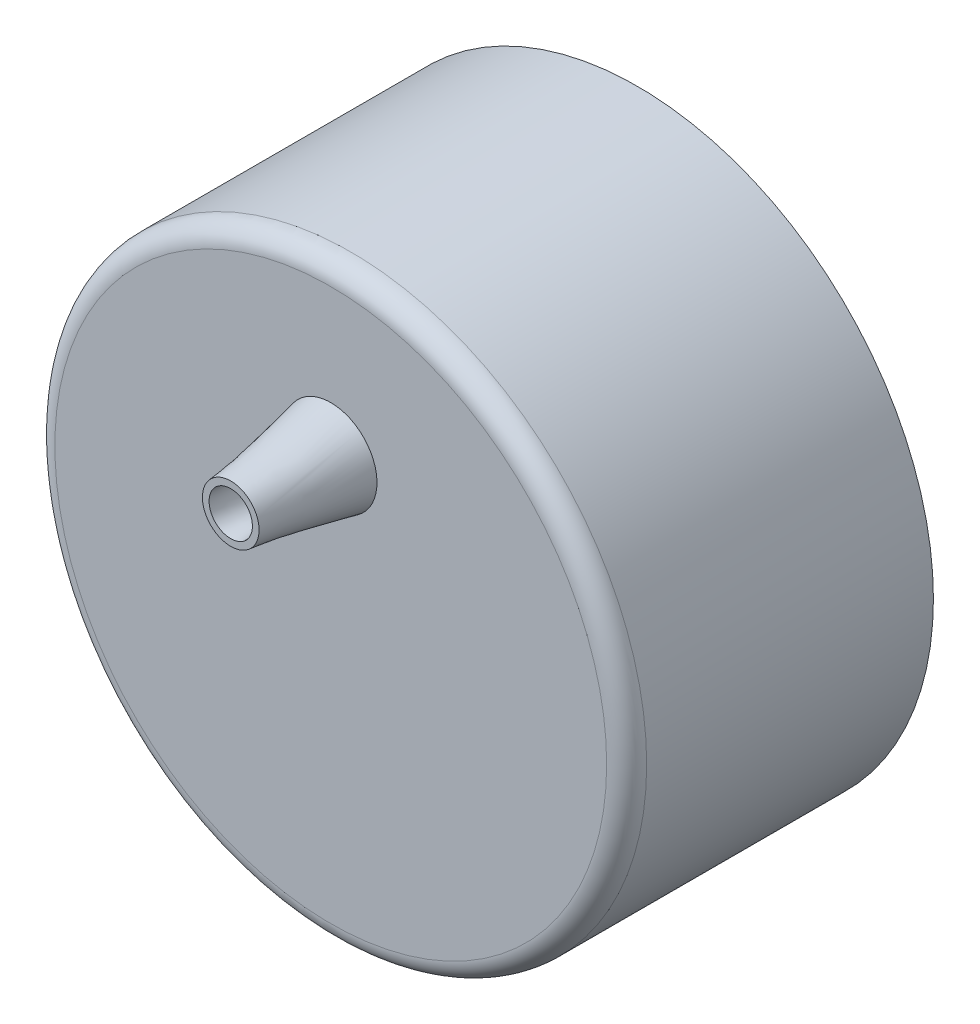
ISO-10303-21;
HEADER;
FILE_DESCRIPTION(('STEP AP214'),'2;1');
FILE_NAME('part.step','',(''),(''),'','','');
FILE_SCHEMA(('AUTOMOTIVE_DESIGN { 1 0 10303 214 1 1 1 1 }'));
ENDSEC;
DATA;
#1=APPLICATION_CONTEXT('core data for automotive mechanical design processes');
#2=APPLICATION_PROTOCOL_DEFINITION('international standard','automotive_design',2000,#1);
#3=PRODUCT_CONTEXT('',#1,'mechanical');
#4=PRODUCT('Part','Part','',(#3));
#5=PRODUCT_RELATED_PRODUCT_CATEGORY('part','',(#4));
#6=PRODUCT_DEFINITION_FORMATION('','',#4);
#7=PRODUCT_DEFINITION_CONTEXT('part definition',#1,'design');
#8=PRODUCT_DEFINITION('design','',#6,#7);
#9=PRODUCT_DEFINITION_SHAPE('','',#8);
#10=(LENGTH_UNIT() NAMED_UNIT(*) SI_UNIT(.MILLI.,.METRE.));
#11=(NAMED_UNIT(*) PLANE_ANGLE_UNIT() SI_UNIT($,.RADIAN.));
#12=(NAMED_UNIT(*) SI_UNIT($,.STERADIAN.) SOLID_ANGLE_UNIT());
#13=UNCERTAINTY_MEASURE_WITH_UNIT(LENGTH_MEASURE(1.E-05),#10,'distance_accuracy_value','');
#14=(GEOMETRIC_REPRESENTATION_CONTEXT(3) GLOBAL_UNCERTAINTY_ASSIGNED_CONTEXT((#13)) GLOBAL_UNIT_ASSIGNED_CONTEXT((#10,
#11,#12)) REPRESENTATION_CONTEXT('',''));
#15=CARTESIAN_POINT('',(0.,0.,0.));
#16=DIRECTION('',(0.,0.,1.));
#17=DIRECTION('',(1.,0.,0.));
#18=AXIS2_PLACEMENT_3D('',#15,#16,#17);
#19=CARTESIAN_POINT('',(177.565086814611,-57.2311730373818,61.));
#20=DIRECTION('',(0.,0.,1.));
#21=DIRECTION('',(1.,0.,0.));
#22=AXIS2_PLACEMENT_3D('',#19,#20,#21);
#23=PLANE('',#22);
#24=CARTESIAN_POINT('',(177.565086814611,-57.2311730373818,61.));
#25=DIRECTION('',(0.,0.,1.));
#26=DIRECTION('',(1.,0.,0.));
#27=AXIS2_PLACEMENT_3D('',#24,#25,#26);
#28=CIRCLE('',#27,3.25000000000001);
#29=CARTESIAN_POINT('',(180.786296753826,-56.7995406388017,61.));
#30=VERTEX_POINT('',#29);
#31=EDGE_CURVE('E63',#30,#30,#28,.T.);
#32=ORIENTED_EDGE('',*,*,#31,.F.);
#33=EDGE_LOOP('',(#32));
#34=FACE_BOUND('',#33,.T.);
#35=CARTESIAN_POINT('',(177.565086814611,-57.2311730373818,61.));
#36=DIRECTION('',(0.,0.,1.));
#37=DIRECTION('',(1.,0.,0.));
#38=AXIS2_PLACEMENT_3D('',#35,#36,#37);
#39=CIRCLE('',#38,4.25000000000001);
#40=CARTESIAN_POINT('',(181.556543196127,-55.7714552720413,61.));
#41=VERTEX_POINT('',#40);
#42=EDGE_CURVE('E12',#41,#41,#39,.T.);
#43=ORIENTED_EDGE('',*,*,#42,.T.);
#44=EDGE_LOOP('',(#43));
#45=FACE_BOUND('',#44,.T.);
#46=ADVANCED_FACE('F50',(#34,#45),#23,.T.);
#47=CARTESIAN_POINT('',(177.565086814611,-57.2311730373818,46.));
#48=DIRECTION('',(0.,0.,1.));
#49=DIRECTION('',(1.,0.,0.));
#50=AXIS2_PLACEMENT_3D('',#47,#48,#49);
#51=PLANE('',#50);
#52=CARTESIAN_POINT('',(177.565086814611,-57.2311730373818,46.));
#53=DIRECTION('',(0.,0.,1.));
#54=DIRECTION('',(1.,0.,0.));
#55=AXIS2_PLACEMENT_3D('',#52,#53,#54);
#56=CIRCLE('',#55,4.93);
#57=CARTESIAN_POINT('',(178.564828180719,-52.4036045810165,46.));
#58=VERTEX_POINT('',#57);
#59=EDGE_CURVE('E128',#58,#58,#56,.T.);
#60=ORIENTED_EDGE('',*,*,#59,.T.);
#61=EDGE_LOOP('',(#60));
#62=FACE_BOUND('',#61,.T.);
#63=CARTESIAN_POINT('',(177.565086814611,-57.2311730373818,46.));
#64=DIRECTION('',(0.,0.,1.));
#65=DIRECTION('',(1.,0.,0.));
#66=AXIS2_PLACEMENT_3D('',#63,#64,#65);
#67=CIRCLE('',#66,6.93);
#68=CARTESIAN_POINT('',(181.894619380869,-51.8200689210563,46.));
#69=VERTEX_POINT('',#68);
#70=EDGE_CURVE('E58',#69,#69,#67,.T.);
#71=ORIENTED_EDGE('',*,*,#70,.F.);
#72=EDGE_LOOP('',(#71));
#73=FACE_BOUND('',#72,.T.);
#74=ADVANCED_FACE('F82',(#62,#73),#51,.F.);
#75=CARTESIAN_POINT('',(181.894619380869,-51.8200689210563,46.));
#76=CARTESIAN_POINT('',(181.556543196127,-55.7714552720413,61.));
#77=CARTESIAN_POINT('',(171.072411148218,-43.161003788541,46.));
#78=CARTESIAN_POINT('',(178.637107665446,-47.7885425090081,61.));
#79=CARTESIAN_POINT('',(162.413346015702,-53.983212021192,46.));
#80=CARTESIAN_POINT('',(170.654194902413,-50.7079780396891,61.));
#81=CARTESIAN_POINT('',(173.235554248353,-62.6422771537073,46.));
#82=CARTESIAN_POINT('',(173.573630433094,-58.6908908027223,61.));
#83=CARTESIAN_POINT('',(184.057762481004,-71.3013422862225,46.));
#84=CARTESIAN_POINT('',(176.493065963775,-66.6738035657554,61.));
#85=CARTESIAN_POINT('',(192.716827613519,-60.4791340535716,46.));
#86=CARTESIAN_POINT('',(184.475978726808,-63.7543680350744,61.));
#87=CARTESIAN_POINT('',(181.894619380869,-51.8200689210563,46.));
#88=CARTESIAN_POINT('',(181.556543196127,-55.7714552720413,61.));
#89=(BOUNDED_SURFACE() B_SPLINE_SURFACE(3,1,((#75,#76),(#77,#78),(#79,#80),(#81,#82),(#83,#84),
(#85,#86),(#87,#88)),.UNSPECIFIED.,.T.,.F.,.F.) B_SPLINE_SURFACE_WITH_KNOTS((4,3,4),(2,2),(0.,
0.5,1.),(0.,1.),.UNSPECIFIED.) GEOMETRIC_REPRESENTATION_ITEM() RATIONAL_B_SPLINE_SURFACE(((1.,
1.),(0.333333333333333,0.333333333333333),(0.333333333333333,0.333333333333333),(1.,1.),
(0.333333333333333,0.333333333333334),(0.333333333333333,0.333333333333334),(1.,1.))) REPRESENTATION_ITEM('') SURFACE());
#90=CARTESIAN_POINT('',(181.894619380869,-51.8200689210563,46.));
#91=CARTESIAN_POINT('',(181.891097753944,-51.8612291955457,46.15625));
#92=CARTESIAN_POINT('',(181.88757612702,-51.9023894700352,46.3125));
#93=CARTESIAN_POINT('',(181.880532873171,-51.984710019014,46.625));
#94=CARTESIAN_POINT('',(181.877011246247,-52.0258702935035,46.78125));
#95=CARTESIAN_POINT('',(181.869967992398,-52.1081908424823,47.09375));
#96=CARTESIAN_POINT('',(181.866446365473,-52.1493511169717,47.25));
#97=CARTESIAN_POINT('',(181.859403111625,-52.2316716659506,47.5625));
#98=CARTESIAN_POINT('',(181.8558814847,-52.27283194044,47.71875));
#99=CARTESIAN_POINT('',(181.848838230852,-52.3551524894189,48.03125));
#100=CARTESIAN_POINT('',(181.845316603927,-52.3963127639083,48.1875));
#101=CARTESIAN_POINT('',(181.838273350078,-52.4786333128871,48.5));
#102=CARTESIAN_POINT('',(181.834751723154,-52.5197935873766,48.65625));
#103=CARTESIAN_POINT('',(181.827708469305,-52.6021141363554,48.96875));
#104=CARTESIAN_POINT('',(181.824186842381,-52.6432744108448,49.125));
#105=CARTESIAN_POINT('',(181.817143588532,-52.7255949598237,49.4375));
#106=CARTESIAN_POINT('',(181.813621961608,-52.7667552343131,49.59375));
#107=CARTESIAN_POINT('',(181.806578707759,-52.849075783292,49.90625));
#108=CARTESIAN_POINT('',(181.803057080834,-52.8902360577814,50.0625));
#109=CARTESIAN_POINT('',(181.796013826986,-52.9725566067603,50.375));
#110=CARTESIAN_POINT('',(181.792492200061,-53.0137168812497,50.53125));
#111=CARTESIAN_POINT('',(181.785448946213,-53.0960374302285,50.84375));
#112=CARTESIAN_POINT('',(181.781927319288,-53.137197704718,51.));
#113=CARTESIAN_POINT('',(181.774884065439,-53.2195182536968,51.3125));
#114=CARTESIAN_POINT('',(181.771362438515,-53.2606785281863,51.46875));
#115=CARTESIAN_POINT('',(181.764319184666,-53.3429990771651,51.78125));
#116=CARTESIAN_POINT('',(181.760797557742,-53.3841593516545,51.9375));
#117=CARTESIAN_POINT('',(181.753754303893,-53.4664799006334,52.25));
#118=CARTESIAN_POINT('',(181.750232676969,-53.5076401751228,52.40625));
#119=CARTESIAN_POINT('',(181.74318942312,-53.5899607241017,52.71875));
#120=CARTESIAN_POINT('',(181.739667796196,-53.6311209985911,52.875));
#121=CARTESIAN_POINT('',(181.732624542347,-53.7134415475699,53.1875));
#122=CARTESIAN_POINT('',(181.729102915422,-53.7546018220594,53.34375));
#123=CARTESIAN_POINT('',(181.722059661574,-53.8369223710382,53.65625));
#124=CARTESIAN_POINT('',(181.718538034649,-53.8780826455277,53.8125));
#125=CARTESIAN_POINT('',(181.7114947808,-53.9604031945065,54.125));
#126=CARTESIAN_POINT('',(181.707973153876,-54.0015634689959,54.28125));
#127=CARTESIAN_POINT('',(181.700929900027,-54.0838840179748,54.59375));
#128=CARTESIAN_POINT('',(181.697408273103,-54.1250442924642,54.75));
#129=CARTESIAN_POINT('',(181.690365019254,-54.2073648414431,55.0625));
#130=CARTESIAN_POINT('',(181.68684339233,-54.2485251159325,55.21875));
#131=CARTESIAN_POINT('',(181.679800138481,-54.3308456649114,55.53125));
#132=CARTESIAN_POINT('',(181.676278511557,-54.3720059394008,55.6875));
#133=CARTESIAN_POINT('',(181.669235257708,-54.4543264883796,56.));
#134=CARTESIAN_POINT('',(181.665713630783,-54.4954867628691,56.15625));
#135=CARTESIAN_POINT('',(181.658670376935,-54.5778073118479,56.46875));
#136=CARTESIAN_POINT('',(181.65514875001,-54.6189675863373,56.625));
#137=CARTESIAN_POINT('',(181.648105496161,-54.7012881353162,56.9375));
#138=CARTESIAN_POINT('',(181.644583869237,-54.7424484098056,57.09375));
#139=CARTESIAN_POINT('',(181.637540615388,-54.8247689587845,57.40625));
#140=CARTESIAN_POINT('',(181.634018988464,-54.8659292332739,57.5625));
#141=CARTESIAN_POINT('',(181.626975734615,-54.9482497822528,57.875));
#142=CARTESIAN_POINT('',(181.623454107691,-54.9894100567422,58.03125));
#143=CARTESIAN_POINT('',(181.616410853842,-55.071730605721,58.34375));
#144=CARTESIAN_POINT('',(181.612889226918,-55.1128908802105,58.5));
#145=CARTESIAN_POINT('',(181.605845973069,-55.1952114291893,58.8125));
#146=CARTESIAN_POINT('',(181.602324346144,-55.2363717036787,58.96875));
#147=CARTESIAN_POINT('',(181.595281092296,-55.3186922526576,59.28125));
#148=CARTESIAN_POINT('',(181.591759465371,-55.359852527147,59.4375));
#149=CARTESIAN_POINT('',(181.584716211523,-55.4421730761259,59.75));
#150=CARTESIAN_POINT('',(181.581194584598,-55.4833333506153,59.90625));
#151=CARTESIAN_POINT('',(181.574151330749,-55.5656538995942,60.21875));
#152=CARTESIAN_POINT('',(181.570629703825,-55.6068141740836,60.375));
#153=CARTESIAN_POINT('',(181.563586449976,-55.6891347230624,60.6875));
#154=CARTESIAN_POINT('',(181.560064823052,-55.7302949975519,60.84375));
#155=CARTESIAN_POINT('',(181.556543196127,-55.7714552720413,61.));
#156=B_SPLINE_CURVE_WITH_KNOTS('',3,(#90,#91,#92,#93,#94,#95,#96,#97,#98,#99,#100,#101,#102,
#103,#104,#105,#106,#107,#108,#109,#110,#111,#112,#113,#114,#115,#116,#117,#118,#119,#120,#121,
#122,#123,#124,#125,#126,#127,#128,#129,#130,#131,#132,#133,#134,#135,#136,#137,#138,#139,#140,
#141,#142,#143,#144,#145,#146,#147,#148,#149,#150,#151,#152,#153,#154,#155),.UNSPECIFIED.,.F.,
.F.,(4,2,2,2,2,2,2,2,2,2,2,2,2,2,2,2,2,2,2,2,2,2,2,2,2,2,2,2,2,2,2,2,4),(0.,0.484856363235702,
0.969712726471409,1.45456908970712,1.93942545294283,2.42428181617853,2.90913817941424,
3.39399454264995,3.87885090588566,4.36370726912136,4.84856363235706,5.33341999559278,
5.81827635882848,6.30313272206419,6.7879890852999,7.27284544853561,7.75770181177131,
8.24255817500701,8.72741453824272,9.21227090147844,9.69712726471414,10.1819836279498,
10.6668399911856,11.1516963544213,11.636552717657,12.1214090808927,12.6062654441284,
13.0911218073641,13.5759781705998,14.0608345338355,14.5456908970712,15.0305472603069,
15.5154036235426),.UNSPECIFIED.);
#157=EDGE_CURVE('BSEAM91',#69,#41,#156,.T.);
#158=ORIENTED_EDGE('',*,*,#70,.T.);
#159=ORIENTED_EDGE('',*,*,#42,.F.);
#160=ORIENTED_EDGE('',*,*,#157,.T.);
#161=ORIENTED_EDGE('',*,*,#157,.F.);
#162=EDGE_LOOP('',(#158,#160,#159,#161));
#163=FACE_BOUND('',#162,.T.);
#164=ADVANCED_FACE('F91',(#163),#89,.T.);
#165=CARTESIAN_POINT('',(178.564828180719,-52.4036045810165,46.));
#166=CARTESIAN_POINT('',(180.786296753826,-56.7995406388017,61.));
#167=CARTESIAN_POINT('',(168.909691267988,-50.4041218488012,46.));
#168=CARTESIAN_POINT('',(179.923031956665,-50.3571207603722,61.));
#169=CARTESIAN_POINT('',(166.910208535773,-60.0592587615319,46.));
#170=CARTESIAN_POINT('',(173.480612078236,-51.2203855575323,61.));
#171=CARTESIAN_POINT('',(176.565345448503,-62.0587414937471,46.));
#172=CARTESIAN_POINT('',(174.343876875396,-57.6628054359619,61.));
#173=CARTESIAN_POINT('',(186.220482361234,-64.0582242259623,46.));
#174=CARTESIAN_POINT('',(175.207141672556,-64.1052253143914,61.));
#175=CARTESIAN_POINT('',(188.219965093449,-54.4030873132317,46.));
#176=CARTESIAN_POINT('',(181.649561550986,-63.2419605172313,61.));
#177=CARTESIAN_POINT('',(178.564828180719,-52.4036045810165,46.));
#178=CARTESIAN_POINT('',(180.786296753826,-56.7995406388017,61.));
#179=(BOUNDED_SURFACE() B_SPLINE_SURFACE(3,1,((#165,#166),(#167,#168),(#169,#170),(#171,#172),
(#173,#174),(#175,#176),(#177,#178)),.UNSPECIFIED.,.T.,.F.,.F.) B_SPLINE_SURFACE_WITH_KNOTS((4,
3,4),(2,2),(0.,0.5,1.),(0.,1.),
.UNSPECIFIED.) GEOMETRIC_REPRESENTATION_ITEM() RATIONAL_B_SPLINE_SURFACE(((1.,1.),
(0.333333333333333,0.333333333333333),(0.333333333333333,0.333333333333333),(1.,1.),
(0.333333333333333,0.333333333333333),(0.333333333333333,0.333333333333333),(1.,1.))) REPRESENTATION_ITEM('') SURFACE());
#180=CARTESIAN_POINT('',(178.564828180719,-52.4036045810165,46.));
#181=CARTESIAN_POINT('',(178.587968478355,-52.4493955816184,46.15625));
#182=CARTESIAN_POINT('',(178.611108775992,-52.4951865822203,46.3125));
#183=CARTESIAN_POINT('',(178.657389371265,-52.5867685834242,46.625));
#184=CARTESIAN_POINT('',(178.680529668901,-52.6325595840261,46.78125));
#185=CARTESIAN_POINT('',(178.726810264174,-52.72414158523,47.09375));
#186=CARTESIAN_POINT('',(178.749950561811,-52.7699325858319,47.25));
#187=CARTESIAN_POINT('',(178.796231157084,-52.8615145870358,47.5625));
#188=CARTESIAN_POINT('',(178.81937145472,-52.9073055876377,47.71875));
#189=CARTESIAN_POINT('',(178.865652049993,-52.9988875888416,48.03125));
#190=CARTESIAN_POINT('',(178.88879234763,-53.0446785894435,48.1875));
#191=CARTESIAN_POINT('',(178.935072942903,-53.1362605906473,48.5));
#192=CARTESIAN_POINT('',(178.95821324054,-53.1820515912493,48.65625));
#193=CARTESIAN_POINT('',(179.004493835813,-53.2736335924531,48.96875));
#194=CARTESIAN_POINT('',(179.027634133449,-53.3194245930551,49.125));
#195=CARTESIAN_POINT('',(179.073914728722,-53.4110065942589,49.4375));
#196=CARTESIAN_POINT('',(179.097055026359,-53.4567975948609,49.59375));
#197=CARTESIAN_POINT('',(179.143335621632,-53.5483795960647,49.90625));
#198=CARTESIAN_POINT('',(179.166475919268,-53.5941705966666,50.0625));
#199=CARTESIAN_POINT('',(179.212756514541,-53.6857525978705,50.375));
#200=CARTESIAN_POINT('',(179.235896812178,-53.7315435984724,50.53125));
#201=CARTESIAN_POINT('',(179.282177407451,-53.8231255996763,50.84375));
#202=CARTESIAN_POINT('',(179.305317705088,-53.8689166002782,51.));
#203=CARTESIAN_POINT('',(179.351598300361,-53.9604986014821,51.3125));
#204=CARTESIAN_POINT('',(179.374738597997,-54.006289602084,51.46875));
#205=CARTESIAN_POINT('',(179.42101919327,-54.0978716032879,51.78125));
#206=CARTESIAN_POINT('',(179.444159490907,-54.1436626038898,51.9375));
#207=CARTESIAN_POINT('',(179.49044008618,-54.2352446050937,52.25));
#208=CARTESIAN_POINT('',(179.513580383816,-54.2810356056956,52.40625));
#209=CARTESIAN_POINT('',(179.559860979089,-54.3726176068994,52.71875));
#210=CARTESIAN_POINT('',(179.583001276726,-54.4184086075014,52.875));
#211=CARTESIAN_POINT('',(179.629281871999,-54.5099906087052,53.1875));
#212=CARTESIAN_POINT('',(179.652422169636,-54.5557816093072,53.34375));
#213=CARTESIAN_POINT('',(179.698702764909,-54.647363610511,53.65625));
#214=CARTESIAN_POINT('',(179.721843062545,-54.6931546111129,53.8125));
#215=CARTESIAN_POINT('',(179.768123657818,-54.7847366123168,54.125));
#216=CARTESIAN_POINT('',(179.791263955455,-54.8305276129187,54.28125));
#217=CARTESIAN_POINT('',(179.837544550728,-54.9221096141226,54.59375));
#218=CARTESIAN_POINT('',(179.860684848364,-54.9679006147245,54.75));
#219=CARTESIAN_POINT('',(179.906965443637,-55.0594826159284,55.0625));
#220=CARTESIAN_POINT('',(179.930105741274,-55.1052736165303,55.21875));
#221=CARTESIAN_POINT('',(179.976386336547,-55.1968556177342,55.53125));
#222=CARTESIAN_POINT('',(179.999526634184,-55.2426466183361,55.6875));
#223=CARTESIAN_POINT('',(180.045807229457,-55.33422861954,56.));
#224=CARTESIAN_POINT('',(180.068947527093,-55.3800196201419,56.15625));
#225=CARTESIAN_POINT('',(180.115228122366,-55.4716016213457,56.46875));
#226=CARTESIAN_POINT('',(180.138368420003,-55.5173926219477,56.625));
#227=CARTESIAN_POINT('',(180.184649015276,-55.6089746231515,56.9375));
#228=CARTESIAN_POINT('',(180.207789312912,-55.6547656237535,57.09375));
#229=CARTESIAN_POINT('',(180.254069908185,-55.7463476249573,57.40625));
#230=CARTESIAN_POINT('',(180.277210205822,-55.7921386255593,57.5625));
#231=CARTESIAN_POINT('',(180.323490801095,-55.8837206267631,57.875));
#232=CARTESIAN_POINT('',(180.346631098732,-55.929511627365,58.03125));
#233=CARTESIAN_POINT('',(180.392911694005,-56.0210936285689,58.34375));
#234=CARTESIAN_POINT('',(180.416051991641,-56.0668846291708,58.5));
#235=CARTESIAN_POINT('',(180.462332586914,-56.1584666303747,58.8125));
#236=CARTESIAN_POINT('',(180.485472884551,-56.2042576309766,58.96875));
#237=CARTESIAN_POINT('',(180.531753479824,-56.2958396321805,59.28125));
#238=CARTESIAN_POINT('',(180.55489377746,-56.3416306327824,59.4375));
#239=CARTESIAN_POINT('',(180.601174372733,-56.4332126339863,59.75));
#240=CARTESIAN_POINT('',(180.62431467037,-56.4790036345882,59.90625));
#241=CARTESIAN_POINT('',(180.670595265643,-56.5705856357921,60.21875));
#242=CARTESIAN_POINT('',(180.69373556328,-56.616376636394,60.375));
#243=CARTESIAN_POINT('',(180.740016158553,-56.7079586375978,60.6875));
#244=CARTESIAN_POINT('',(180.763156456189,-56.7537496381998,60.84375));
#245=CARTESIAN_POINT('',(180.786296753826,-56.7995406388017,61.));
#246=B_SPLINE_CURVE_WITH_KNOTS('',3,(#180,#181,#182,#183,#184,#185,#186,#187,#188,#189,#190,
#191,#192,#193,#194,#195,#196,#197,#198,#199,#200,#201,#202,#203,#204,#205,#206,#207,#208,#209,
#210,#211,#212,#213,#214,#215,#216,#217,#218,#219,#220,#221,#222,#223,#224,#225,#226,#227,#228,
#229,#230,#231,#232,#233,#234,#235,#236,#237,#238,#239,#240,#241,#242,#243,#244,#245),
.UNSPECIFIED.,.F.,.F.,(4,2,2,2,2,2,2,2,2,2,2,2,2,2,2,2,2,2,2,2,2,2,2,2,2,2,2,2,2,2,2,2,4),(0.,
0.493373250691092,0.986746501382189,1.48011975207329,1.97349300276439,2.46686625345547,
2.96023950414657,3.45361275483767,3.94698600552877,4.44035925621986,4.93373250691096,
5.42710575760205,5.92047900829315,6.41385225898424,6.90722550967534,7.40059876036644,
7.89397201105753,8.38734526174863,8.88071851243973,9.37409176313083,9.86746501382192,
10.360838264513,10.8542115152041,11.3475847658952,11.8409580165863,12.3343312672774,
12.8277045179685,13.3210777686596,13.8144510193507,14.3078242700418,14.8011975207329,
15.294570771424,15.7879440221151),.UNSPECIFIED.);
#247=EDGE_CURVE('BSEAM93',#58,#30,#246,.T.);
#248=ORIENTED_EDGE('',*,*,#59,.F.);
#249=ORIENTED_EDGE('',*,*,#31,.T.);
#250=ORIENTED_EDGE('',*,*,#247,.T.);
#251=ORIENTED_EDGE('',*,*,#247,.F.);
#252=EDGE_LOOP('',(#248,#250,#249,#251));
#253=FACE_BOUND('',#252,.T.);
#254=ADVANCED_FACE('F93',(#253),#179,.F.);
#255=CLOSED_SHELL('',(#46,#74,#164,#254));
#256=MANIFOLD_SOLID_BREP('B2',#255);
#257=CARTESIAN_POINT('',(177.565086814611,-76.6061730373818,0.));
#258=DIRECTION('',(0.,0.,1.));
#259=DIRECTION('',(1.,0.,0.));
#260=AXIS2_PLACEMENT_3D('',#257,#258,#259);
#261=PLANE('',#260);
#262=CARTESIAN_POINT('',(177.565086814611,-76.6061730373818,0.));
#263=DIRECTION('',(0.,0.,1.));
#264=DIRECTION('',(1.,0.,0.));
#265=AXIS2_PLACEMENT_3D('',#262,#263,#264);
#266=CIRCLE('',#265,44.375);
#267=CARTESIAN_POINT('',(221.940086814611,-76.6061730373818,0.));
#268=VERTEX_POINT('',#267);
#269=EDGE_CURVE('E197',#268,#268,#266,.T.);
#270=ORIENTED_EDGE('',*,*,#269,.F.);
#271=EDGE_LOOP('',(#270));
#272=FACE_BOUND('',#271,.T.);
#273=CARTESIAN_POINT('',(177.565086814611,-76.6061730373818,0.));
#274=DIRECTION('',(0.,0.,1.));
#275=DIRECTION('',(1.,0.,0.));
#276=AXIS2_PLACEMENT_3D('',#273,#274,#275);
#277=CIRCLE('',#276,41.375);
#278=CARTESIAN_POINT('',(218.940086814611,-76.6061730373818,0.));
#279=VERTEX_POINT('',#278);
#280=EDGE_CURVE('E200',#279,#279,#277,.T.);
#281=ORIENTED_EDGE('',*,*,#280,.T.);
#282=EDGE_LOOP('',(#281));
#283=FACE_BOUND('',#282,.T.);
#284=ADVANCED_FACE('F177',(#272,#283),#261,.F.);
#285=CARTESIAN_POINT('',(177.565086814611,-76.6061730373818,40.));
#286=DIRECTION('',(0.,0.,-1.));
#287=DIRECTION('',(-1.,0.,0.));
#288=AXIS2_PLACEMENT_3D('',#285,#286,#287);
#289=CYLINDRICAL_SURFACE('',#288,44.375);
#290=CARTESIAN_POINT('',(177.565086814611,-76.6061730373818,43.));
#291=DIRECTION('',(0.,0.,1.));
#292=DIRECTION('',(1.,0.,0.));
#293=AXIS2_PLACEMENT_3D('',#290,#291,#292);
#294=CIRCLE('',#293,44.375);
#295=CARTESIAN_POINT('',(221.940086814611,-76.6061730373818,43.));
#296=VERTEX_POINT('',#295);
#297=EDGE_CURVE('E49',#296,#296,#294,.F.);
#298=ORIENTED_EDGE('',*,*,#297,.T.);
#299=EDGE_LOOP('',(#298));
#300=FACE_BOUND('',#299,.T.);
#301=ORIENTED_EDGE('',*,*,#269,.T.);
#302=EDGE_LOOP('',(#301));
#303=FACE_BOUND('',#302,.T.);
#304=ADVANCED_FACE('F228',(#300,#303),#289,.T.);
#305=CARTESIAN_POINT('',(177.565086814611,-76.6061730373818,40.));
#306=DIRECTION('',(0.,0.,-1.));
#307=DIRECTION('',(-1.,0.,0.));
#308=AXIS2_PLACEMENT_3D('',#305,#306,#307);
#309=CYLINDRICAL_SURFACE('',#308,41.375);
#310=CARTESIAN_POINT('',(177.565086814611,-76.6061730373818,33.));
#311=DIRECTION('',(0.,0.,1.));
#312=DIRECTION('',(1.,0.,0.));
#313=AXIS2_PLACEMENT_3D('',#310,#311,#312);
#314=CIRCLE('',#313,41.375);
#315=CARTESIAN_POINT('',(218.940086814611,-76.6061730373818,33.));
#316=VERTEX_POINT('',#315);
#317=EDGE_CURVE('E192',#316,#316,#314,.T.);
#318=ORIENTED_EDGE('',*,*,#317,.T.);
#319=EDGE_LOOP('',(#318));
#320=FACE_BOUND('',#319,.T.);
#321=ORIENTED_EDGE('',*,*,#280,.F.);
#322=EDGE_LOOP('',(#321));
#323=FACE_BOUND('',#322,.T.);
#324=ADVANCED_FACE('F223',(#320,#323),#309,.F.);
#325=CARTESIAN_POINT('',(177.565086814611,-76.6061730373818,40.));
#326=DIRECTION('',(0.,0.,1.));
#327=DIRECTION('',(1.,0.,0.));
#328=AXIS2_PLACEMENT_3D('',#325,#326,#327);
#329=PLANE('',#328);
#330=CARTESIAN_POINT('',(177.565086814611,-57.2311730373818,40.));
#331=DIRECTION('',(0.,0.,1.));
#332=DIRECTION('',(1.,0.,0.));
#333=AXIS2_PLACEMENT_3D('',#330,#331,#332);
#334=CIRCLE('',#333,4.93);
#335=CARTESIAN_POINT('',(182.495086814611,-57.2311730373818,40.));
#336=VERTEX_POINT('',#335);
#337=EDGE_CURVE('E203',#336,#336,#334,.F.);
#338=ORIENTED_EDGE('',*,*,#337,.F.);
#339=EDGE_LOOP('',(#338));
#340=FACE_BOUND('',#339,.T.);
#341=CARTESIAN_POINT('',(177.565086814611,-76.6061730373818,40.));
#342=DIRECTION('',(0.,0.,1.));
#343=DIRECTION('',(1.,0.,0.));
#344=AXIS2_PLACEMENT_3D('',#341,#342,#343);
#345=CIRCLE('',#344,34.375);
#346=CARTESIAN_POINT('',(211.940086814611,-76.6061730373818,40.));
#347=VERTEX_POINT('',#346);
#348=EDGE_CURVE('E188',#347,#347,#345,.F.);
#349=ORIENTED_EDGE('',*,*,#348,.T.);
#350=EDGE_LOOP('',(#349));
#351=FACE_BOUND('',#350,.T.);
#352=ADVANCED_FACE('F216',(#340,#351),#329,.F.);
#353=CARTESIAN_POINT('',(177.565086814611,-76.6061730373818,46.));
#354=DIRECTION('',(0.,0.,1.));
#355=DIRECTION('',(1.,0.,0.));
#356=AXIS2_PLACEMENT_3D('',#353,#354,#355);
#357=PLANE('',#356);
#358=CARTESIAN_POINT('',(177.565086814611,-57.2311730373818,46.));
#359=DIRECTION('',(0.,0.,1.));
#360=DIRECTION('',(1.,0.,0.));
#361=AXIS2_PLACEMENT_3D('',#358,#359,#360);
#362=CIRCLE('',#361,4.93);
#363=CARTESIAN_POINT('',(182.495086814611,-57.2311730373818,46.));
#364=VERTEX_POINT('',#363);
#365=EDGE_CURVE('E206',#364,#364,#362,.T.);
#366=ORIENTED_EDGE('',*,*,#365,.F.);
#367=EDGE_LOOP('',(#366));
#368=FACE_BOUND('',#367,.T.);
#369=CARTESIAN_POINT('',(177.565086814611,-76.6061730373818,46.));
#370=DIRECTION('',(0.,0.,1.));
#371=DIRECTION('',(1.,0.,0.));
#372=AXIS2_PLACEMENT_3D('',#369,#370,#371);
#373=CIRCLE('',#372,41.375);
#374=CARTESIAN_POINT('',(218.940086814611,-76.6061730373818,46.));
#375=VERTEX_POINT('',#374);
#376=EDGE_CURVE('E184',#375,#375,#373,.T.);
#377=ORIENTED_EDGE('',*,*,#376,.T.);
#378=EDGE_LOOP('',(#377));
#379=FACE_BOUND('',#378,.T.);
#380=ADVANCED_FACE('F213',(#368,#379),#357,.T.);
#381=CARTESIAN_POINT('',(177.565086814611,-76.6061730373818,33.));
#382=DIRECTION('',(0.,0.,1.));
#383=DIRECTION('',(1.,0.,0.));
#384=AXIS2_PLACEMENT_3D('',#381,#382,#383);
#385=TOROIDAL_SURFACE('',#384,34.375,7.);
#386=ORIENTED_EDGE('',*,*,#348,.F.);
#387=EDGE_LOOP('',(#386));
#388=FACE_BOUND('',#387,.T.);
#389=ORIENTED_EDGE('',*,*,#317,.F.);
#390=EDGE_LOOP('',(#389));
#391=FACE_BOUND('',#390,.T.);
#392=ADVANCED_FACE('F215',(#388,#391),#385,.F.);
#393=CARTESIAN_POINT('',(177.565086814611,-76.6061730373818,43.));
#394=DIRECTION('',(0.,0.,1.));
#395=DIRECTION('',(1.,0.,0.));
#396=AXIS2_PLACEMENT_3D('',#393,#394,#395);
#397=TOROIDAL_SURFACE('',#396,41.375,3.);
#398=ORIENTED_EDGE('',*,*,#297,.F.);
#399=EDGE_LOOP('',(#398));
#400=FACE_BOUND('',#399,.T.);
#401=ORIENTED_EDGE('',*,*,#376,.F.);
#402=EDGE_LOOP('',(#401));
#403=FACE_BOUND('',#402,.T.);
#404=ADVANCED_FACE('F179',(#400,#403),#397,.T.);
#405=CARTESIAN_POINT('',(177.565086814611,-57.2311730373818,-0.001000000000001));
#406=DIRECTION('',(0.,0.,1.));
#407=DIRECTION('',(1.,0.,0.));
#408=AXIS2_PLACEMENT_3D('',#405,#406,#407);
#409=CYLINDRICAL_SURFACE('',#408,4.93);
#410=ORIENTED_EDGE('',*,*,#365,.T.);
#411=EDGE_LOOP('',(#410));
#412=FACE_BOUND('',#411,.T.);
#413=ORIENTED_EDGE('',*,*,#337,.T.);
#414=EDGE_LOOP('',(#413));
#415=FACE_BOUND('',#414,.T.);
#416=ADVANCED_FACE('F210',(#412,#415),#409,.F.);
#417=CLOSED_SHELL('',(#284,#304,#324,#352,#380,#392,#404,#416));
#418=MANIFOLD_SOLID_BREP('B7',#417);
#419=ADVANCED_BREP_SHAPE_REPRESENTATION('',(#18,#256,#418),#14);
#420=SHAPE_DEFINITION_REPRESENTATION(#9,#419);
ENDSEC;
END-ISO-10303-21;
